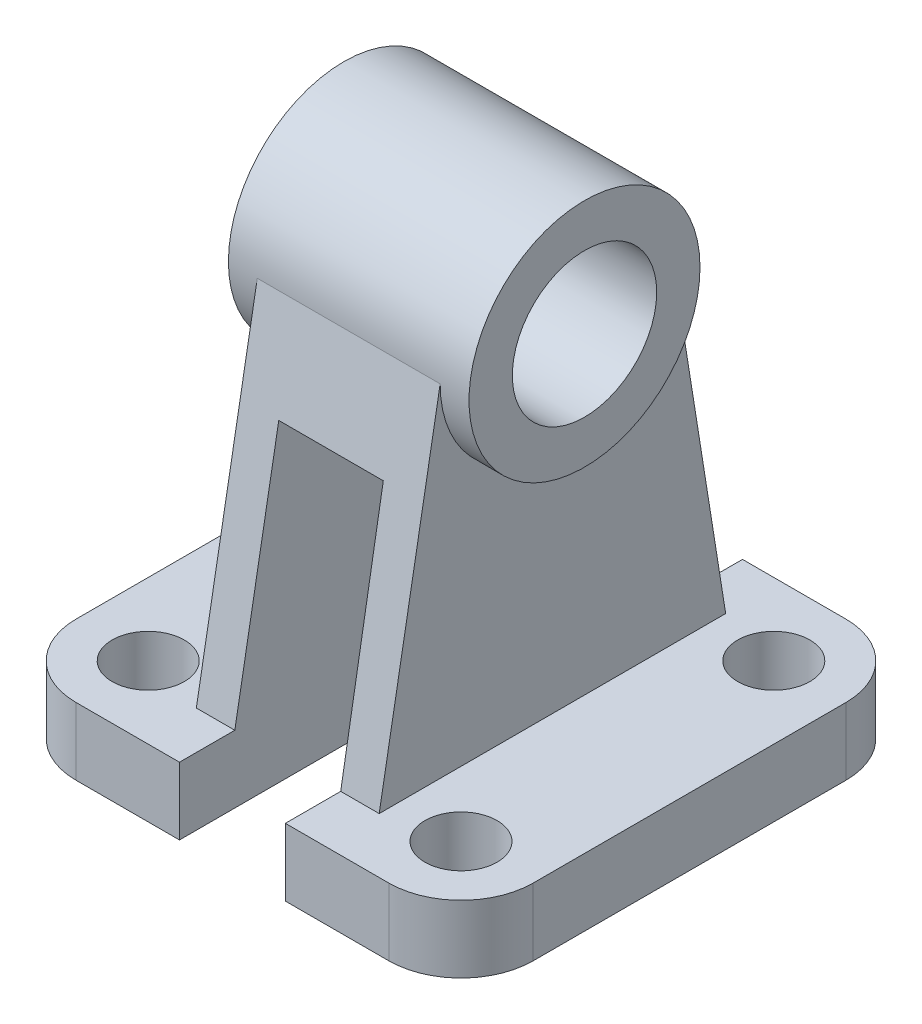
ISO-10303-21;
HEADER;
FILE_DESCRIPTION(('STEP AP214'),'2;1');
FILE_NAME('part.step','',(''),(''),'','','');
FILE_SCHEMA(('AUTOMOTIVE_DESIGN { 1 0 10303 214 1 1 1 1 }'));
ENDSEC;
DATA;
#1=APPLICATION_CONTEXT('core data for automotive mechanical design processes');
#2=APPLICATION_PROTOCOL_DEFINITION('international standard','automotive_design',2000,#1);
#3=PRODUCT_CONTEXT('',#1,'mechanical');
#4=PRODUCT('Part','Part','',(#3));
#5=PRODUCT_RELATED_PRODUCT_CATEGORY('part','',(#4));
#6=PRODUCT_DEFINITION_FORMATION('','',#4);
#7=PRODUCT_DEFINITION_CONTEXT('part definition',#1,'design');
#8=PRODUCT_DEFINITION('design','',#6,#7);
#9=PRODUCT_DEFINITION_SHAPE('','',#8);
#10=(LENGTH_UNIT() NAMED_UNIT(*) SI_UNIT(.MILLI.,.METRE.));
#11=(NAMED_UNIT(*) PLANE_ANGLE_UNIT() SI_UNIT($,.RADIAN.));
#12=(NAMED_UNIT(*) SI_UNIT($,.STERADIAN.) SOLID_ANGLE_UNIT());
#13=UNCERTAINTY_MEASURE_WITH_UNIT(LENGTH_MEASURE(1.E-05),#10,'distance_accuracy_value','');
#14=(GEOMETRIC_REPRESENTATION_CONTEXT(3) GLOBAL_UNCERTAINTY_ASSIGNED_CONTEXT((#13)) GLOBAL_UNIT_ASSIGNED_CONTEXT((#10,
#11,#12)) REPRESENTATION_CONTEXT('',''));
#15=CARTESIAN_POINT('',(0.,0.,0.));
#16=DIRECTION('',(0.,0.,1.));
#17=DIRECTION('',(1.,0.,0.));
#18=AXIS2_PLACEMENT_3D('',#15,#16,#17);
#19=CARTESIAN_POINT('',(-9.63203457629437,0.,-80.));
#20=DIRECTION('',(0.,-1.,0.));
#21=DIRECTION('',(0.,0.,-1.));
#22=AXIS2_PLACEMENT_3D('',#19,#20,#21);
#23=PLANE('',#22);
#24=CARTESIAN_POINT('',(-9.63203457629448,0.,-15.));
#25=DIRECTION('',(0.,1.,0.));
#26=DIRECTION('',(0.,0.,1.));
#27=AXIS2_PLACEMENT_3D('',#24,#25,#26);
#28=CIRCLE('',#27,7.5);
#29=CARTESIAN_POINT('',(-9.63203457629448,0.,-7.5));
#30=VERTEX_POINT('',#29);
#31=EDGE_CURVE('E497',#30,#30,#28,.T.);
#32=ORIENTED_EDGE('',*,*,#31,.F.);
#33=EDGE_LOOP('',(#32));
#34=FACE_BOUND('',#33,.T.);
#35=CARTESIAN_POINT('',(-9.63203457629437,0.,-80.));
#36=DIRECTION('',(0.,1.,0.));
#37=DIRECTION('',(0.,0.,1.));
#38=AXIS2_PLACEMENT_3D('',#35,#36,#37);
#39=CIRCLE('',#38,7.5);
#40=CARTESIAN_POINT('',(-9.63203457629437,0.,-72.5));
#41=VERTEX_POINT('',#40);
#42=EDGE_CURVE('E493',#41,#41,#39,.T.);
#43=ORIENTED_EDGE('',*,*,#42,.F.);
#44=EDGE_LOOP('',(#43));
#45=FACE_BOUND('',#44,.T.);
#46=DIRECTION('',(1.,0.,0.));
#47=VECTOR('',#46,1.);
#48=CARTESIAN_POINT('',(3.86796542370552,0.,-11.5));
#49=LINE('',#48,#47);
#50=CARTESIAN_POINT('',(3.86796542370552,0.,-11.5));
#51=VERTEX_POINT('',#50);
#52=CARTESIAN_POINT('',(11.8679654237055,0.,-11.5));
#53=VERTEX_POINT('',#52);
#54=EDGE_CURVE('E269',#51,#53,#49,.T.);
#55=ORIENTED_EDGE('',*,*,#54,.F.);
#56=DIRECTION('',(0.,0.,1.));
#57=VECTOR('',#56,1.);
#58=CARTESIAN_POINT('',(3.86796542370552,0.,0.));
#59=LINE('',#58,#57);
#60=CARTESIAN_POINT('',(3.86796542370552,0.,-83.5));
#61=VERTEX_POINT('',#60);
#62=EDGE_CURVE('E274',#61,#51,#59,.T.);
#63=ORIENTED_EDGE('',*,*,#62,.F.);
#64=DIRECTION('',(1.,0.,0.));
#65=VECTOR('',#64,1.);
#66=CARTESIAN_POINT('',(3.86796542370552,0.,-83.5));
#67=LINE('',#66,#65);
#68=CARTESIAN_POINT('',(11.8679654237055,0.,-83.5));
#69=VERTEX_POINT('',#68);
#70=EDGE_CURVE('E488',#61,#69,#67,.T.);
#71=ORIENTED_EDGE('',*,*,#70,.T.);
#72=DIRECTION('',(0.,0.,-1.));
#73=VECTOR('',#72,1.);
#74=CARTESIAN_POINT('',(11.8679654237055,0.,0.));
#75=LINE('',#74,#73);
#76=CARTESIAN_POINT('',(11.8679654237055,0.,-95.));
#77=VERTEX_POINT('',#76);
#78=EDGE_CURVE('E144',#69,#77,#75,.T.);
#79=ORIENTED_EDGE('',*,*,#78,.T.);
#80=DIRECTION('',(-1.,0.,0.));
#81=VECTOR('',#80,1.);
#82=CARTESIAN_POINT('',(-9.63203457629437,0.,-95.));
#83=LINE('',#82,#81);
#84=CARTESIAN_POINT('',(-9.63203457629437,0.,-95.));
#85=VERTEX_POINT('',#84);
#86=EDGE_CURVE('E143',#77,#85,#83,.T.);
#87=ORIENTED_EDGE('',*,*,#86,.T.);
#88=CARTESIAN_POINT('',(-9.63203457629437,0.,-80.));
#89=DIRECTION('',(0.,1.,0.));
#90=DIRECTION('',(0.,0.,-1.));
#91=AXIS2_PLACEMENT_3D('',#88,#89,#90);
#92=CIRCLE('',#91,15.);
#93=CARTESIAN_POINT('',(-24.6320345762944,0.,-80.));
#94=VERTEX_POINT('',#93);
#95=EDGE_CURVE('E147',#85,#94,#92,.T.);
#96=ORIENTED_EDGE('',*,*,#95,.T.);
#97=DIRECTION('',(0.,0.,1.));
#98=VECTOR('',#97,1.);
#99=CARTESIAN_POINT('',(-24.6320345762945,0.,-15.0000000000001));
#100=LINE('',#99,#98);
#101=CARTESIAN_POINT('',(-24.6320345762945,0.,-15.0000000000001));
#102=VERTEX_POINT('',#101);
#103=EDGE_CURVE('E150',#94,#102,#100,.T.);
#104=ORIENTED_EDGE('',*,*,#103,.T.);
#105=CARTESIAN_POINT('',(-9.63203457629448,0.,-15.));
#106=DIRECTION('',(0.,1.,0.));
#107=DIRECTION('',(0.,0.,-1.));
#108=AXIS2_PLACEMENT_3D('',#105,#106,#107);
#109=CIRCLE('',#108,15.);
#110=CARTESIAN_POINT('',(-9.63203457629437,0.,0.));
#111=VERTEX_POINT('',#110);
#112=EDGE_CURVE('E116',#102,#111,#109,.T.);
#113=ORIENTED_EDGE('',*,*,#112,.T.);
#114=DIRECTION('',(1.,0.,0.));
#115=VECTOR('',#114,1.);
#116=CARTESIAN_POINT('',(-9.63203457629437,0.,0.));
#117=LINE('',#116,#115);
#118=CARTESIAN_POINT('',(11.8679654237055,0.,0.));
#119=VERTEX_POINT('',#118);
#120=EDGE_CURVE('E153',#111,#119,#117,.T.);
#121=ORIENTED_EDGE('',*,*,#120,.T.);
#122=EDGE_CURVE('E140',#119,#53,#75,.T.);
#123=ORIENTED_EDGE('',*,*,#122,.T.);
#124=EDGE_LOOP('',(#55,#63,#71,#79,#87,#96,#104,#113,#121,#123));
#125=FACE_BOUND('',#124,.T.);
#126=ADVANCED_FACE('F39',(#34,#45,#125),#23,.F.);
#127=CARTESIAN_POINT('',(11.8679654237055,-14.,0.));
#128=DIRECTION('',(1.,0.,0.));
#129=DIRECTION('',(0.,0.,-1.));
#130=AXIS2_PLACEMENT_3D('',#127,#128,#129);
#131=PLANE('',#130);
#132=ORIENTED_EDGE('',*,*,#122,.F.);
#133=DIRECTION('',(0.,1.,0.));
#134=VECTOR('',#133,1.);
#135=CARTESIAN_POINT('',(11.8679654237055,-14.,0.));
#136=LINE('',#135,#134);
#137=CARTESIAN_POINT('',(11.8679654237055,-14.,0.));
#138=VERTEX_POINT('',#137);
#139=EDGE_CURVE('E63',#138,#119,#136,.T.);
#140=ORIENTED_EDGE('',*,*,#139,.F.);
#141=DIRECTION('',(0.,0.,-1.));
#142=VECTOR('',#141,1.);
#143=CARTESIAN_POINT('',(11.8679654237055,-14.,0.));
#144=LINE('',#143,#142);
#145=CARTESIAN_POINT('',(11.8679654237055,-14.,-95.));
#146=VERTEX_POINT('',#145);
#147=EDGE_CURVE('E156',#138,#146,#144,.T.);
#148=ORIENTED_EDGE('',*,*,#147,.T.);
#149=DIRECTION('',(0.,1.,0.));
#150=VECTOR('',#149,1.);
#151=CARTESIAN_POINT('',(11.8679654237055,-14.,-95.));
#152=LINE('',#151,#150);
#153=EDGE_CURVE('E97',#146,#77,#152,.T.);
#154=ORIENTED_EDGE('',*,*,#153,.T.);
#155=ORIENTED_EDGE('',*,*,#78,.F.);
#156=DIRECTION('',(0.,0.987498818473332,0.157626404874858));
#157=VECTOR('',#156,1.);
#158=CARTESIAN_POINT('',(11.8679654237055,-16.26609578385,-86.0964245746868));
#159=LINE('',#158,#157);
#160=CARTESIAN_POINT('',(11.8679654237055,41.1475956372231,-76.9319439697487));
#161=VERTEX_POINT('',#160);
#162=EDGE_CURVE('E385',#69,#161,#159,.T.);
#163=ORIENTED_EDGE('',*,*,#162,.T.);
#164=DIRECTION('',(0.,0.175633100115761,0.984455694352837));
#165=VECTOR('',#164,1.);
#166=CARTESIAN_POINT('',(11.8679654237055,36.3222335929638,-103.978982020402));
#167=LINE('',#166,#165);
#168=CARTESIAN_POINT('',(11.8679654237055,51.1916961063475,-20.6329212060196));
#169=VERTEX_POINT('',#168);
#170=EDGE_CURVE('E262',#161,#169,#167,.T.);
#171=ORIENTED_EDGE('',*,*,#170,.T.);
#172=DIRECTION('',(0.,-0.984455694352837,0.175633100115761));
#173=VECTOR('',#172,1.);
#174=CARTESIAN_POINT('',(11.8679654237055,0.,-11.5));
#175=LINE('',#174,#173);
#176=EDGE_CURVE('E259',#169,#53,#175,.T.);
#177=ORIENTED_EDGE('',*,*,#176,.T.);
#178=EDGE_LOOP('',(#132,#140,#148,#154,#155,#163,#171,#177));
#179=FACE_BOUND('',#178,.T.);
#180=ADVANCED_FACE('F41',(#179),#131,.T.);
#181=CARTESIAN_POINT('',(-9.63203457629437,-14.,0.));
#182=DIRECTION('',(0.,0.,1.));
#183=DIRECTION('',(1.,0.,0.));
#184=AXIS2_PLACEMENT_3D('',#181,#182,#183);
#185=PLANE('',#184);
#186=ORIENTED_EDGE('',*,*,#120,.F.);
#187=DIRECTION('',(0.,1.,0.));
#188=VECTOR('',#187,1.);
#189=CARTESIAN_POINT('',(-9.63203457629437,-14.,0.));
#190=LINE('',#189,#188);
#191=CARTESIAN_POINT('',(-9.63203457629437,-14.,0.));
#192=VERTEX_POINT('',#191);
#193=EDGE_CURVE('E121',#192,#111,#190,.T.);
#194=ORIENTED_EDGE('',*,*,#193,.F.);
#195=DIRECTION('',(1.,0.,0.));
#196=VECTOR('',#195,1.);
#197=CARTESIAN_POINT('',(-9.63203457629437,-14.,0.));
#198=LINE('',#197,#196);
#199=EDGE_CURVE('E130',#192,#138,#198,.T.);
#200=ORIENTED_EDGE('',*,*,#199,.T.);
#201=ORIENTED_EDGE('',*,*,#139,.T.);
#202=EDGE_LOOP('',(#186,#194,#200,#201));
#203=FACE_BOUND('',#202,.T.);
#204=ADVANCED_FACE('F276',(#203),#185,.T.);
#205=CARTESIAN_POINT('',(-9.63203457629448,-14.,-15.));
#206=DIRECTION('',(0.,1.,0.));
#207=DIRECTION('',(0.,0.,1.));
#208=AXIS2_PLACEMENT_3D('',#205,#206,#207);
#209=CYLINDRICAL_SURFACE('',#208,15.);
#210=ORIENTED_EDGE('',*,*,#112,.F.);
#211=DIRECTION('',(0.,1.,0.));
#212=VECTOR('',#211,1.);
#213=CARTESIAN_POINT('',(-24.6320345762945,-14.,-15.0000000000001));
#214=LINE('',#213,#212);
#215=CARTESIAN_POINT('',(-24.6320345762945,-14.,-15.0000000000001));
#216=VERTEX_POINT('',#215);
#217=EDGE_CURVE('E110',#216,#102,#214,.T.);
#218=ORIENTED_EDGE('',*,*,#217,.F.);
#219=CARTESIAN_POINT('',(-9.63203457629448,-14.,-15.));
#220=DIRECTION('',(0.,1.,0.));
#221=DIRECTION('',(0.,0.,-1.));
#222=AXIS2_PLACEMENT_3D('',#219,#220,#221);
#223=CIRCLE('',#222,15.);
#224=EDGE_CURVE('E113',#216,#192,#223,.T.);
#225=ORIENTED_EDGE('',*,*,#224,.T.);
#226=ORIENTED_EDGE('',*,*,#193,.T.);
#227=EDGE_LOOP('',(#210,#218,#225,#226));
#228=FACE_BOUND('',#227,.T.);
#229=ADVANCED_FACE('F112',(#228),#209,.T.);
#230=CARTESIAN_POINT('',(-24.6320345762945,-14.,-15.0000000000001));
#231=DIRECTION('',(-1.,0.,0.));
#232=DIRECTION('',(0.,0.,1.));
#233=AXIS2_PLACEMENT_3D('',#230,#231,#232);
#234=PLANE('',#233);
#235=ORIENTED_EDGE('',*,*,#103,.F.);
#236=DIRECTION('',(0.,1.,0.));
#237=VECTOR('',#236,1.);
#238=CARTESIAN_POINT('',(-24.6320345762944,-14.,-80.));
#239=LINE('',#238,#237);
#240=CARTESIAN_POINT('',(-24.6320345762944,-14.,-80.));
#241=VERTEX_POINT('',#240);
#242=EDGE_CURVE('E122',#241,#94,#239,.T.);
#243=ORIENTED_EDGE('',*,*,#242,.F.);
#244=DIRECTION('',(0.,0.,1.));
#245=VECTOR('',#244,1.);
#246=CARTESIAN_POINT('',(-24.6320345762945,-14.,-15.0000000000001));
#247=LINE('',#246,#245);
#248=EDGE_CURVE('E128',#241,#216,#247,.T.);
#249=ORIENTED_EDGE('',*,*,#248,.T.);
#250=ORIENTED_EDGE('',*,*,#217,.T.);
#251=EDGE_LOOP('',(#235,#243,#249,#250));
#252=FACE_BOUND('',#251,.T.);
#253=ADVANCED_FACE('F132',(#252),#234,.T.);
#254=CARTESIAN_POINT('',(-9.63203457629437,-14.,-80.));
#255=DIRECTION('',(0.,1.,0.));
#256=DIRECTION('',(0.,0.,1.));
#257=AXIS2_PLACEMENT_3D('',#254,#255,#256);
#258=CYLINDRICAL_SURFACE('',#257,15.);
#259=ORIENTED_EDGE('',*,*,#95,.F.);
#260=DIRECTION('',(0.,1.,0.));
#261=VECTOR('',#260,1.);
#262=CARTESIAN_POINT('',(-9.63203457629437,-14.,-95.));
#263=LINE('',#262,#261);
#264=CARTESIAN_POINT('',(-9.63203457629437,-14.,-95.));
#265=VERTEX_POINT('',#264);
#266=EDGE_CURVE('E160',#265,#85,#263,.T.);
#267=ORIENTED_EDGE('',*,*,#266,.F.);
#268=CARTESIAN_POINT('',(-9.63203457629437,-14.,-80.));
#269=DIRECTION('',(0.,1.,0.));
#270=DIRECTION('',(0.,0.,-1.));
#271=AXIS2_PLACEMENT_3D('',#268,#269,#270);
#272=CIRCLE('',#271,15.);
#273=EDGE_CURVE('E133',#265,#241,#272,.T.);
#274=ORIENTED_EDGE('',*,*,#273,.T.);
#275=ORIENTED_EDGE('',*,*,#242,.T.);
#276=EDGE_LOOP('',(#259,#267,#274,#275));
#277=FACE_BOUND('',#276,.T.);
#278=ADVANCED_FACE('F534',(#277),#258,.T.);
#279=CARTESIAN_POINT('',(-9.63203457629437,-14.,-95.));
#280=DIRECTION('',(0.,0.,-1.));
#281=DIRECTION('',(-1.,0.,0.));
#282=AXIS2_PLACEMENT_3D('',#279,#280,#281);
#283=PLANE('',#282);
#284=ORIENTED_EDGE('',*,*,#86,.F.);
#285=ORIENTED_EDGE('',*,*,#153,.F.);
#286=DIRECTION('',(-1.,0.,0.));
#287=VECTOR('',#286,1.);
#288=CARTESIAN_POINT('',(-9.63203457629437,-14.,-95.));
#289=LINE('',#288,#287);
#290=EDGE_CURVE('E135',#146,#265,#289,.T.);
#291=ORIENTED_EDGE('',*,*,#290,.T.);
#292=ORIENTED_EDGE('',*,*,#266,.T.);
#293=EDGE_LOOP('',(#284,#285,#291,#292));
#294=FACE_BOUND('',#293,.T.);
#295=ADVANCED_FACE('F295',(#294),#283,.T.);
#296=CARTESIAN_POINT('',(-9.63203457629437,-14.,-80.));
#297=DIRECTION('',(0.,-1.,0.));
#298=DIRECTION('',(0.,0.,-1.));
#299=AXIS2_PLACEMENT_3D('',#296,#297,#298);
#300=PLANE('',#299);
#301=CARTESIAN_POINT('',(-9.63203457629437,-14.,-80.));
#302=DIRECTION('',(0.,1.,0.));
#303=DIRECTION('',(0.,0.,1.));
#304=AXIS2_PLACEMENT_3D('',#301,#302,#303);
#305=CIRCLE('',#304,7.5);
#306=CARTESIAN_POINT('',(-9.63203457629437,-14.,-72.5));
#307=VERTEX_POINT('',#306);
#308=EDGE_CURVE('E494',#307,#307,#305,.T.);
#309=ORIENTED_EDGE('',*,*,#308,.T.);
#310=EDGE_LOOP('',(#309));
#311=FACE_BOUND('',#310,.T.);
#312=CARTESIAN_POINT('',(-9.63203457629448,-14.,-15.));
#313=DIRECTION('',(0.,1.,0.));
#314=DIRECTION('',(0.,0.,1.));
#315=AXIS2_PLACEMENT_3D('',#312,#313,#314);
#316=CIRCLE('',#315,7.5);
#317=CARTESIAN_POINT('',(-9.63203457629448,-14.,-7.5));
#318=VERTEX_POINT('',#317);
#319=EDGE_CURVE('E500',#318,#318,#316,.T.);
#320=ORIENTED_EDGE('',*,*,#319,.T.);
#321=EDGE_LOOP('',(#320));
#322=FACE_BOUND('',#321,.T.);
#323=ORIENTED_EDGE('',*,*,#147,.F.);
#324=ORIENTED_EDGE('',*,*,#199,.F.);
#325=ORIENTED_EDGE('',*,*,#224,.F.);
#326=ORIENTED_EDGE('',*,*,#248,.F.);
#327=ORIENTED_EDGE('',*,*,#273,.F.);
#328=ORIENTED_EDGE('',*,*,#290,.F.);
#329=EDGE_LOOP('',(#323,#324,#325,#326,#327,#328));
#330=FACE_BOUND('',#329,.T.);
#331=ADVANCED_FACE('F126',(#311,#322,#330),#300,.T.);
#332=CARTESIAN_POINT('',(-9.63203457629448,-14.,-15.));
#333=DIRECTION('',(0.,1.,0.));
#334=DIRECTION('',(0.,0.,1.));
#335=AXIS2_PLACEMENT_3D('',#332,#333,#334);
#336=CYLINDRICAL_SURFACE('',#335,7.5);
#337=ORIENTED_EDGE('',*,*,#319,.F.);
#338=EDGE_LOOP('',(#337));
#339=FACE_BOUND('',#338,.T.);
#340=ORIENTED_EDGE('',*,*,#31,.T.);
#341=EDGE_LOOP('',(#340));
#342=FACE_BOUND('',#341,.T.);
#343=ADVANCED_FACE('F294',(#339,#342),#336,.F.);
#344=CARTESIAN_POINT('',(-9.63203457629437,-14.,-80.));
#345=DIRECTION('',(0.,1.,0.));
#346=DIRECTION('',(0.,0.,1.));
#347=AXIS2_PLACEMENT_3D('',#344,#345,#346);
#348=CYLINDRICAL_SURFACE('',#347,7.5);
#349=ORIENTED_EDGE('',*,*,#308,.F.);
#350=EDGE_LOOP('',(#349));
#351=FACE_BOUND('',#350,.T.);
#352=ORIENTED_EDGE('',*,*,#42,.T.);
#353=EDGE_LOOP('',(#352));
#354=FACE_BOUND('',#353,.T.);
#355=ADVANCED_FACE('F299',(#351,#354),#348,.F.);
#356=CARTESIAN_POINT('',(3.86796542370552,0.,0.));
#357=DIRECTION('',(0.,1.,0.));
#358=DIRECTION('',(0.,0.,1.));
#359=AXIS2_PLACEMENT_3D('',#356,#357,#358);
#360=PLANE('',#359);
#361=DIRECTION('',(0.,0.,1.));
#362=VECTOR('',#361,1.);
#363=CARTESIAN_POINT('',(33.8679654237055,0.,0.));
#364=LINE('',#363,#362);
#365=CARTESIAN_POINT('',(33.8679654237055,0.,-83.5));
#366=VERTEX_POINT('',#365);
#367=CARTESIAN_POINT('',(33.8679654237055,0.,-11.5));
#368=VERTEX_POINT('',#367);
#369=EDGE_CURVE('E480',#366,#368,#364,.T.);
#370=ORIENTED_EDGE('',*,*,#369,.T.);
#371=DIRECTION('',(0.000943540534123292,0.,0.999999554865531));
#372=VECTOR('',#371,1.);
#373=CARTESIAN_POINT('',(33.7807075457544,0.,-103.979163272682));
#374=LINE('',#373,#372);
#375=CARTESIAN_POINT('',(33.8000304750085,0.,-83.5));
#376=VERTEX_POINT('',#375);
#377=EDGE_CURVE('E386',#376,#368,#374,.T.);
#378=ORIENTED_EDGE('',*,*,#377,.F.);
#379=EDGE_CURVE('E273',#376,#366,#67,.T.);
#380=ORIENTED_EDGE('',*,*,#379,.T.);
#381=EDGE_LOOP('',(#370,#378,#380));
#382=FACE_BOUND('',#381,.T.);
#383=ADVANCED_FACE('F303',(#382),#360,.F.);
#384=CARTESIAN_POINT('',(3.86796542370552,-1.98838456354674,-11.1452596626529));
#385=DIRECTION('',(0.,-0.175633100115761,-0.984455694352837));
#386=DIRECTION('',(0.,0.984455694352837,-0.175633100115761));
#387=AXIS2_PLACEMENT_3D('',#384,#385,#386);
#388=PLANE('',#387);
#389=ORIENTED_EDGE('',*,*,#54,.T.);
#390=ORIENTED_EDGE('',*,*,#176,.F.);
#391=DIRECTION('',(-1.,0.,0.));
#392=VECTOR('',#391,1.);
#393=CARTESIAN_POINT('',(11.8679654237055,51.1916961063475,-20.6329212060196));
#394=LINE('',#393,#392);
#395=CARTESIAN_POINT('',(33.5886095985096,51.1916961063475,-20.6329212060196));
#396=VERTEX_POINT('',#395);
#397=EDGE_CURVE('E266',#396,#169,#394,.T.);
#398=ORIENTED_EDGE('',*,*,#397,.F.);
#399=DIRECTION('',(-0.00537214988582703,0.984441488557431,-0.175630565712333));
#400=VECTOR('',#399,1.);
#401=CARTESIAN_POINT('',(33.5886095985096,51.1916961063475,-20.6329212060196));
#402=LINE('',#401,#400);
#403=EDGE_CURVE('E507',#368,#396,#402,.T.);
#404=ORIENTED_EDGE('',*,*,#403,.F.);
#405=DIRECTION('',(-1.,0.,0.));
#406=VECTOR('',#405,1.);
#407=CARTESIAN_POINT('',(41.8679654237055,0.,-11.5));
#408=LINE('',#407,#406);
#409=CARTESIAN_POINT('',(41.8679654237055,0.,-11.5));
#410=VERTEX_POINT('',#409);
#411=EDGE_CURVE('E416',#410,#368,#408,.T.);
#412=ORIENTED_EDGE('',*,*,#411,.F.);
#413=DIRECTION('',(0.,0.984455694352837,-0.175633100115761));
#414=VECTOR('',#413,1.);
#415=CARTESIAN_POINT('',(41.8679654237055,-1.98838456354674,-11.1452596626529));
#416=LINE('',#415,#414);
#417=CARTESIAN_POINT('',(41.8679654237055,71.,-24.1668474566715));
#418=VERTEX_POINT('',#417);
#419=EDGE_CURVE('E408',#410,#418,#416,.T.);
#420=ORIENTED_EDGE('',*,*,#419,.T.);
#421=DIRECTION('',(1.,0.,0.));
#422=VECTOR('',#421,1.);
#423=CARTESIAN_POINT('',(3.86796542370552,71.,-24.1668474566715));
#424=LINE('',#423,#422);
#425=CARTESIAN_POINT('',(3.86796542370552,71.,-24.1668474566715));
#426=VERTEX_POINT('',#425);
#427=EDGE_CURVE('E186',#426,#418,#424,.T.);
#428=ORIENTED_EDGE('',*,*,#427,.F.);
#429=DIRECTION('',(0.,0.984455694352837,-0.175633100115761));
#430=VECTOR('',#429,1.);
#431=CARTESIAN_POINT('',(3.86796542370552,-1.98838456354674,-11.1452596626529));
#432=LINE('',#431,#430);
#433=EDGE_CURVE('E176',#51,#426,#432,.T.);
#434=ORIENTED_EDGE('',*,*,#433,.F.);
#435=EDGE_LOOP('',(#389,#390,#398,#404,#412,#420,#428,#434));
#436=FACE_BOUND('',#435,.T.);
#437=ADVANCED_FACE('F270',(#436),#388,.F.);
#438=CARTESIAN_POINT('',(3.86796542370552,71.,-48.1668474566715));
#439=DIRECTION('',(1.,0.,0.));
#440=DIRECTION('',(0.,0.,-1.));
#441=AXIS2_PLACEMENT_3D('',#438,#439,#440);
#442=CYLINDRICAL_SURFACE('',#441,24.);
#443=ORIENTED_EDGE('',*,*,#427,.T.);
#444=CARTESIAN_POINT('',(41.8679654237055,71.,-48.1668474566715));
#445=DIRECTION('',(-1.,0.,0.));
#446=DIRECTION('',(0.,0.,1.));
#447=AXIS2_PLACEMENT_3D('',#444,#445,#446);
#448=CIRCLE('',#447,24.);
#449=CARTESIAN_POINT('',(41.8679654237055,71.,-72.1668474566715));
#450=VERTEX_POINT('',#449);
#451=EDGE_CURVE('E11',#418,#450,#448,.F.);
#452=ORIENTED_EDGE('',*,*,#451,.T.);
#453=DIRECTION('',(1.,0.,0.));
#454=VECTOR('',#453,1.);
#455=CARTESIAN_POINT('',(3.86796542370552,71.,-72.1668474566715));
#456=LINE('',#455,#454);
#457=CARTESIAN_POINT('',(3.86796542370552,71.,-72.1668474566715));
#458=VERTEX_POINT('',#457);
#459=EDGE_CURVE('E189',#458,#450,#456,.T.);
#460=ORIENTED_EDGE('',*,*,#459,.F.);
#461=CARTESIAN_POINT('',(3.86796542370552,71.,-48.1668474566715));
#462=DIRECTION('',(-1.,0.,0.));
#463=DIRECTION('',(0.,0.,1.));
#464=AXIS2_PLACEMENT_3D('',#461,#462,#463);
#465=CIRCLE('',#464,24.);
#466=EDGE_CURVE('E47',#426,#458,#465,.F.);
#467=ORIENTED_EDGE('',*,*,#466,.F.);
#468=EDGE_LOOP('',(#443,#452,#460,#467));
#469=FACE_BOUND('',#468,.T.);
#470=CARTESIAN_POINT('',(-2.13203457629448,71.,-48.1668474566715));
#471=DIRECTION('',(-1.,0.,0.));
#472=DIRECTION('',(0.,0.,1.));
#473=AXIS2_PLACEMENT_3D('',#470,#471,#472);
#474=CIRCLE('',#473,24.);
#475=CARTESIAN_POINT('',(-2.13203457629448,71.,-24.1668474566715));
#476=VERTEX_POINT('',#475);
#477=EDGE_CURVE('E405',#476,#476,#474,.T.);
#478=ORIENTED_EDGE('',*,*,#477,.F.);
#479=EDGE_LOOP('',(#478));
#480=FACE_BOUND('',#479,.T.);
#481=CARTESIAN_POINT('',(47.8679654237055,71.,-48.1668474566715));
#482=DIRECTION('',(1.,0.,0.));
#483=DIRECTION('',(0.,0.,-1.));
#484=AXIS2_PLACEMENT_3D('',#481,#482,#483);
#485=CIRCLE('',#484,24.);
#486=CARTESIAN_POINT('',(47.8679654237055,71.,-72.1668474566715));
#487=VERTEX_POINT('',#486);
#488=EDGE_CURVE('E395',#487,#487,#485,.T.);
#489=ORIENTED_EDGE('',*,*,#488,.F.);
#490=EDGE_LOOP('',(#489));
#491=FACE_BOUND('',#490,.T.);
#492=ADVANCED_FACE('F184',(#469,#480,#491),#442,.T.);
#493=CARTESIAN_POINT('',(3.86796542370552,12.9972666959391,-81.4253520266));
#494=DIRECTION('',(0.,-0.157626404874858,0.987498818473332));
#495=DIRECTION('',(0.,-0.987498818473332,-0.157626404874858));
#496=AXIS2_PLACEMENT_3D('',#493,#494,#495);
#497=PLANE('',#496);
#498=DIRECTION('',(1.,0.,0.));
#499=VECTOR('',#498,1.);
#500=CARTESIAN_POINT('',(11.8679654237055,41.1475956372231,-76.9319439697487));
#501=LINE('',#500,#499);
#502=CARTESIAN_POINT('',(33.5886095985096,41.1475956372233,-76.9319439697486));
#503=VERTEX_POINT('',#502);
#504=EDGE_CURVE('E383',#161,#503,#501,.T.);
#505=ORIENTED_EDGE('',*,*,#504,.F.);
#506=ORIENTED_EDGE('',*,*,#162,.F.);
#507=ORIENTED_EDGE('',*,*,#70,.F.);
#508=DIRECTION('',(0.,-0.987498818473332,-0.157626404874858));
#509=VECTOR('',#508,1.);
#510=CARTESIAN_POINT('',(3.86796542370552,12.9972666959391,-81.4253520266));
#511=LINE('',#510,#509);
#512=EDGE_CURVE('E172',#458,#61,#511,.T.);
#513=ORIENTED_EDGE('',*,*,#512,.F.);
#514=ORIENTED_EDGE('',*,*,#459,.T.);
#515=DIRECTION('',(0.,0.987498818473332,0.157626404874858));
#516=VECTOR('',#515,1.);
#517=CARTESIAN_POINT('',(41.8679654237055,12.9972666959391,-81.4253520266));
#518=LINE('',#517,#516);
#519=CARTESIAN_POINT('',(41.8679654237055,0.,-83.5));
#520=VERTEX_POINT('',#519);
#521=EDGE_CURVE('E410',#520,#450,#518,.T.);
#522=ORIENTED_EDGE('',*,*,#521,.F.);
#523=DIRECTION('',(-1.,0.,0.));
#524=VECTOR('',#523,1.);
#525=CARTESIAN_POINT('',(41.8679654237055,0.,-83.5));
#526=LINE('',#525,#524);
#527=EDGE_CURVE('E415',#520,#366,#526,.T.);
#528=ORIENTED_EDGE('',*,*,#527,.T.);
#529=ORIENTED_EDGE('',*,*,#379,.F.);
#530=DIRECTION('',(0.00507381233699673,-0.987486107518241,-0.157624375928477));
#531=VECTOR('',#530,1.);
#532=CARTESIAN_POINT('',(33.6344172471558,32.232323717077,-78.3550163167384));
#533=LINE('',#532,#531);
#534=EDGE_CURVE('E389',#503,#376,#533,.T.);
#535=ORIENTED_EDGE('',*,*,#534,.F.);
#536=EDGE_LOOP('',(#505,#506,#507,#513,#514,#522,#528,#529,#535));
#537=FACE_BOUND('',#536,.T.);
#538=ADVANCED_FACE('F309',(#537),#497,.F.);
#539=CARTESIAN_POINT('',(3.86796542370552,0.,0.));
#540=DIRECTION('',(-1.,0.,0.));
#541=DIRECTION('',(0.,0.,1.));
#542=AXIS2_PLACEMENT_3D('',#539,#540,#541);
#543=PLANE('',#542);
#544=ORIENTED_EDGE('',*,*,#433,.T.);
#545=ORIENTED_EDGE('',*,*,#466,.T.);
#546=ORIENTED_EDGE('',*,*,#512,.T.);
#547=ORIENTED_EDGE('',*,*,#62,.T.);
#548=EDGE_LOOP('',(#544,#545,#546,#547));
#549=FACE_BOUND('',#548,.T.);
#550=ADVANCED_FACE('F168',(#549),#543,.T.);
#551=CARTESIAN_POINT('',(33.8679654237055,-14.,0.));
#552=DIRECTION('',(-1.,0.,0.));
#553=DIRECTION('',(0.,0.,1.));
#554=AXIS2_PLACEMENT_3D('',#551,#552,#553);
#555=PLANE('',#554);
#556=ORIENTED_EDGE('',*,*,#369,.F.);
#557=DIRECTION('',(0.,0.,1.));
#558=VECTOR('',#557,1.);
#559=CARTESIAN_POINT('',(33.8679654237055,0.,0.));
#560=LINE('',#559,#558);
#561=CARTESIAN_POINT('',(33.8679654237055,0.,-95.));
#562=VERTEX_POINT('',#561);
#563=EDGE_CURVE('E451',#562,#366,#560,.T.);
#564=ORIENTED_EDGE('',*,*,#563,.F.);
#565=DIRECTION('',(0.,1.,0.));
#566=VECTOR('',#565,1.);
#567=CARTESIAN_POINT('',(33.8679654237055,-14.,-95.));
#568=LINE('',#567,#566);
#569=CARTESIAN_POINT('',(33.8679654237055,-14.,-95.));
#570=VERTEX_POINT('',#569);
#571=EDGE_CURVE('E419',#570,#562,#568,.T.);
#572=ORIENTED_EDGE('',*,*,#571,.F.);
#573=DIRECTION('',(0.,0.,1.));
#574=VECTOR('',#573,1.);
#575=CARTESIAN_POINT('',(33.8679654237055,-14.,0.));
#576=LINE('',#575,#574);
#577=CARTESIAN_POINT('',(33.8679654237055,-14.,0.));
#578=VERTEX_POINT('',#577);
#579=EDGE_CURVE('E438',#570,#578,#576,.T.);
#580=ORIENTED_EDGE('',*,*,#579,.T.);
#581=DIRECTION('',(0.,1.,0.));
#582=VECTOR('',#581,1.);
#583=CARTESIAN_POINT('',(33.8679654237055,-14.,0.));
#584=LINE('',#583,#582);
#585=CARTESIAN_POINT('',(33.8679654237055,0.,0.));
#586=VERTEX_POINT('',#585);
#587=EDGE_CURVE('E421',#578,#586,#584,.T.);
#588=ORIENTED_EDGE('',*,*,#587,.T.);
#589=EDGE_CURVE('E450',#368,#586,#560,.T.);
#590=ORIENTED_EDGE('',*,*,#589,.F.);
#591=EDGE_LOOP('',(#556,#564,#572,#580,#588,#590));
#592=FACE_BOUND('',#591,.T.);
#593=ADVANCED_FACE('F318',(#592),#555,.T.);
#594=CARTESIAN_POINT('',(55.3679654237055,0.,-80.));
#595=DIRECTION('',(0.,-1.,0.));
#596=DIRECTION('',(0.,0.,-1.));
#597=AXIS2_PLACEMENT_3D('',#594,#595,#596);
#598=PLANE('',#597);
#599=CARTESIAN_POINT('',(55.3679654237055,0.,-15.));
#600=DIRECTION('',(0.,1.,0.));
#601=DIRECTION('',(0.,0.,1.));
#602=AXIS2_PLACEMENT_3D('',#599,#600,#601);
#603=CIRCLE('',#602,7.5);
#604=CARTESIAN_POINT('',(55.3679654237055,0.,-7.5));
#605=VERTEX_POINT('',#604);
#606=EDGE_CURVE('E471',#605,#605,#603,.T.);
#607=ORIENTED_EDGE('',*,*,#606,.F.);
#608=EDGE_LOOP('',(#607));
#609=FACE_BOUND('',#608,.T.);
#610=CARTESIAN_POINT('',(55.3679654237055,0.,-80.));
#611=DIRECTION('',(0.,1.,0.));
#612=DIRECTION('',(0.,0.,1.));
#613=AXIS2_PLACEMENT_3D('',#610,#611,#612);
#614=CIRCLE('',#613,7.5);
#615=CARTESIAN_POINT('',(55.3679654237055,0.,-72.5));
#616=VERTEX_POINT('',#615);
#617=EDGE_CURVE('E477',#616,#616,#614,.T.);
#618=ORIENTED_EDGE('',*,*,#617,.F.);
#619=EDGE_LOOP('',(#618));
#620=FACE_BOUND('',#619,.T.);
#621=ORIENTED_EDGE('',*,*,#527,.F.);
#622=DIRECTION('',(0.,0.,-1.));
#623=VECTOR('',#622,1.);
#624=CARTESIAN_POINT('',(41.8679654237055,0.,0.));
#625=LINE('',#624,#623);
#626=EDGE_CURVE('E413',#410,#520,#625,.T.);
#627=ORIENTED_EDGE('',*,*,#626,.F.);
#628=ORIENTED_EDGE('',*,*,#411,.T.);
#629=ORIENTED_EDGE('',*,*,#589,.T.);
#630=DIRECTION('',(1.,0.,0.));
#631=VECTOR('',#630,1.);
#632=CARTESIAN_POINT('',(33.8679654237055,0.,0.));
#633=LINE('',#632,#631);
#634=CARTESIAN_POINT('',(55.3679654237055,0.,0.));
#635=VERTEX_POINT('',#634);
#636=EDGE_CURVE('E447',#586,#635,#633,.T.);
#637=ORIENTED_EDGE('',*,*,#636,.T.);
#638=CARTESIAN_POINT('',(55.3679654237055,0.,-15.));
#639=DIRECTION('',(0.,1.,0.));
#640=DIRECTION('',(0.,0.,1.));
#641=AXIS2_PLACEMENT_3D('',#638,#639,#640);
#642=CIRCLE('',#641,15.);
#643=CARTESIAN_POINT('',(70.3679654237055,0.,-15.));
#644=VERTEX_POINT('',#643);
#645=EDGE_CURVE('E444',#635,#644,#642,.T.);
#646=ORIENTED_EDGE('',*,*,#645,.T.);
#647=DIRECTION('',(0.,0.,-1.));
#648=VECTOR('',#647,1.);
#649=CARTESIAN_POINT('',(70.3679654237055,0.,-15.));
#650=LINE('',#649,#648);
#651=CARTESIAN_POINT('',(70.3679654237055,0.,-80.));
#652=VERTEX_POINT('',#651);
#653=EDGE_CURVE('E441',#644,#652,#650,.T.);
#654=ORIENTED_EDGE('',*,*,#653,.T.);
#655=CARTESIAN_POINT('',(55.3679654237055,0.,-80.));
#656=DIRECTION('',(0.,1.,0.));
#657=DIRECTION('',(0.,0.,-1.));
#658=AXIS2_PLACEMENT_3D('',#655,#656,#657);
#659=CIRCLE('',#658,15.);
#660=CARTESIAN_POINT('',(55.3679654237055,0.,-95.));
#661=VERTEX_POINT('',#660);
#662=EDGE_CURVE('E437',#652,#661,#659,.T.);
#663=ORIENTED_EDGE('',*,*,#662,.T.);
#664=DIRECTION('',(-1.,0.,0.));
#665=VECTOR('',#664,1.);
#666=CARTESIAN_POINT('',(33.8679654237055,0.,-95.));
#667=LINE('',#666,#665);
#668=EDGE_CURVE('E434',#661,#562,#667,.T.);
#669=ORIENTED_EDGE('',*,*,#668,.T.);
#670=ORIENTED_EDGE('',*,*,#563,.T.);
#671=EDGE_LOOP('',(#621,#627,#628,#629,#637,#646,#654,#663,#669,#670));
#672=FACE_BOUND('',#671,.T.);
#673=ADVANCED_FACE('F333',(#609,#620,#672),#598,.F.);
#674=CARTESIAN_POINT('',(33.8679654237055,-14.,-95.));
#675=DIRECTION('',(0.,0.,-1.));
#676=DIRECTION('',(-1.,0.,0.));
#677=AXIS2_PLACEMENT_3D('',#674,#675,#676);
#678=PLANE('',#677);
#679=ORIENTED_EDGE('',*,*,#668,.F.);
#680=DIRECTION('',(0.,1.,0.));
#681=VECTOR('',#680,1.);
#682=CARTESIAN_POINT('',(55.3679654237055,-14.,-95.));
#683=LINE('',#682,#681);
#684=CARTESIAN_POINT('',(55.3679654237055,-14.,-95.));
#685=VERTEX_POINT('',#684);
#686=EDGE_CURVE('E431',#685,#661,#683,.T.);
#687=ORIENTED_EDGE('',*,*,#686,.F.);
#688=DIRECTION('',(-1.,0.,0.));
#689=VECTOR('',#688,1.);
#690=CARTESIAN_POINT('',(33.8679654237055,-14.,-95.));
#691=LINE('',#690,#689);
#692=EDGE_CURVE('E424',#685,#570,#691,.T.);
#693=ORIENTED_EDGE('',*,*,#692,.T.);
#694=ORIENTED_EDGE('',*,*,#571,.T.);
#695=EDGE_LOOP('',(#679,#687,#693,#694));
#696=FACE_BOUND('',#695,.T.);
#697=ADVANCED_FACE('F336',(#696),#678,.T.);
#698=CARTESIAN_POINT('',(55.3679654237055,-14.,-80.));
#699=DIRECTION('',(0.,1.,0.));
#700=DIRECTION('',(0.,0.,1.));
#701=AXIS2_PLACEMENT_3D('',#698,#699,#700);
#702=CYLINDRICAL_SURFACE('',#701,15.);
#703=ORIENTED_EDGE('',*,*,#662,.F.);
#704=DIRECTION('',(0.,1.,0.));
#705=VECTOR('',#704,1.);
#706=CARTESIAN_POINT('',(70.3679654237055,-14.,-80.));
#707=LINE('',#706,#705);
#708=CARTESIAN_POINT('',(70.3679654237055,-14.,-80.));
#709=VERTEX_POINT('',#708);
#710=EDGE_CURVE('E429',#709,#652,#707,.T.);
#711=ORIENTED_EDGE('',*,*,#710,.F.);
#712=CARTESIAN_POINT('',(55.3679654237055,-14.,-80.));
#713=DIRECTION('',(0.,1.,0.));
#714=DIRECTION('',(0.,0.,-1.));
#715=AXIS2_PLACEMENT_3D('',#712,#713,#714);
#716=CIRCLE('',#715,15.);
#717=EDGE_CURVE('E457',#709,#685,#716,.T.);
#718=ORIENTED_EDGE('',*,*,#717,.T.);
#719=ORIENTED_EDGE('',*,*,#686,.T.);
#720=EDGE_LOOP('',(#703,#711,#718,#719));
#721=FACE_BOUND('',#720,.T.);
#722=ADVANCED_FACE('F340',(#721),#702,.T.);
#723=CARTESIAN_POINT('',(70.3679654237055,-14.,-15.));
#724=DIRECTION('',(1.,0.,0.));
#725=DIRECTION('',(0.,0.,-1.));
#726=AXIS2_PLACEMENT_3D('',#723,#724,#725);
#727=PLANE('',#726);
#728=ORIENTED_EDGE('',*,*,#653,.F.);
#729=DIRECTION('',(0.,1.,0.));
#730=VECTOR('',#729,1.);
#731=CARTESIAN_POINT('',(70.3679654237055,-14.,-15.));
#732=LINE('',#731,#730);
#733=CARTESIAN_POINT('',(70.3679654237055,-14.,-15.));
#734=VERTEX_POINT('',#733);
#735=EDGE_CURVE('E427',#734,#644,#732,.T.);
#736=ORIENTED_EDGE('',*,*,#735,.F.);
#737=DIRECTION('',(0.,0.,-1.));
#738=VECTOR('',#737,1.);
#739=CARTESIAN_POINT('',(70.3679654237055,-14.,-15.));
#740=LINE('',#739,#738);
#741=EDGE_CURVE('E460',#734,#709,#740,.T.);
#742=ORIENTED_EDGE('',*,*,#741,.T.);
#743=ORIENTED_EDGE('',*,*,#710,.T.);
#744=EDGE_LOOP('',(#728,#736,#742,#743));
#745=FACE_BOUND('',#744,.T.);
#746=ADVANCED_FACE('F344',(#745),#727,.T.);
#747=CARTESIAN_POINT('',(55.3679654237055,-14.,-15.));
#748=DIRECTION('',(0.,1.,0.));
#749=DIRECTION('',(0.,0.,1.));
#750=AXIS2_PLACEMENT_3D('',#747,#748,#749);
#751=CYLINDRICAL_SURFACE('',#750,15.);
#752=ORIENTED_EDGE('',*,*,#645,.F.);
#753=DIRECTION('',(0.,1.,0.));
#754=VECTOR('',#753,1.);
#755=CARTESIAN_POINT('',(55.3679654237055,-14.,0.));
#756=LINE('',#755,#754);
#757=CARTESIAN_POINT('',(55.3679654237055,-14.,0.));
#758=VERTEX_POINT('',#757);
#759=EDGE_CURVE('E425',#758,#635,#756,.T.);
#760=ORIENTED_EDGE('',*,*,#759,.F.);
#761=CARTESIAN_POINT('',(55.3679654237055,-14.,-15.));
#762=DIRECTION('',(0.,1.,0.));
#763=DIRECTION('',(0.,0.,1.));
#764=AXIS2_PLACEMENT_3D('',#761,#762,#763);
#765=CIRCLE('',#764,15.);
#766=EDGE_CURVE('E463',#758,#734,#765,.T.);
#767=ORIENTED_EDGE('',*,*,#766,.T.);
#768=ORIENTED_EDGE('',*,*,#735,.T.);
#769=EDGE_LOOP('',(#752,#760,#767,#768));
#770=FACE_BOUND('',#769,.T.);
#771=ADVANCED_FACE('F348',(#770),#751,.T.);
#772=CARTESIAN_POINT('',(33.8679654237055,-14.,0.));
#773=DIRECTION('',(0.,0.,1.));
#774=DIRECTION('',(1.,0.,0.));
#775=AXIS2_PLACEMENT_3D('',#772,#773,#774);
#776=PLANE('',#775);
#777=ORIENTED_EDGE('',*,*,#636,.F.);
#778=ORIENTED_EDGE('',*,*,#587,.F.);
#779=DIRECTION('',(1.,0.,0.));
#780=VECTOR('',#779,1.);
#781=CARTESIAN_POINT('',(33.8679654237055,-14.,0.));
#782=LINE('',#781,#780);
#783=EDGE_CURVE('E466',#578,#758,#782,.T.);
#784=ORIENTED_EDGE('',*,*,#783,.T.);
#785=ORIENTED_EDGE('',*,*,#759,.T.);
#786=EDGE_LOOP('',(#777,#778,#784,#785));
#787=FACE_BOUND('',#786,.T.);
#788=ADVANCED_FACE('F331',(#787),#776,.T.);
#789=CARTESIAN_POINT('',(55.3679654237055,-14.,-80.));
#790=DIRECTION('',(0.,-1.,0.));
#791=DIRECTION('',(0.,0.,-1.));
#792=AXIS2_PLACEMENT_3D('',#789,#790,#791);
#793=PLANE('',#792);
#794=CARTESIAN_POINT('',(55.3679654237055,-14.,-80.));
#795=DIRECTION('',(0.,1.,0.));
#796=DIRECTION('',(0.,0.,1.));
#797=AXIS2_PLACEMENT_3D('',#794,#795,#796);
#798=CIRCLE('',#797,7.5);
#799=CARTESIAN_POINT('',(55.3679654237055,-14.,-72.5));
#800=VERTEX_POINT('',#799);
#801=EDGE_CURVE('E474',#800,#800,#798,.T.);
#802=ORIENTED_EDGE('',*,*,#801,.T.);
#803=EDGE_LOOP('',(#802));
#804=FACE_BOUND('',#803,.T.);
#805=CARTESIAN_POINT('',(55.3679654237055,-14.,-15.));
#806=DIRECTION('',(0.,1.,0.));
#807=DIRECTION('',(0.,0.,1.));
#808=AXIS2_PLACEMENT_3D('',#805,#806,#807);
#809=CIRCLE('',#808,7.5);
#810=CARTESIAN_POINT('',(55.3679654237055,-14.,-7.5));
#811=VERTEX_POINT('',#810);
#812=EDGE_CURVE('E454',#811,#811,#809,.T.);
#813=ORIENTED_EDGE('',*,*,#812,.T.);
#814=EDGE_LOOP('',(#813));
#815=FACE_BOUND('',#814,.T.);
#816=ORIENTED_EDGE('',*,*,#579,.F.);
#817=ORIENTED_EDGE('',*,*,#692,.F.);
#818=ORIENTED_EDGE('',*,*,#717,.F.);
#819=ORIENTED_EDGE('',*,*,#741,.F.);
#820=ORIENTED_EDGE('',*,*,#766,.F.);
#821=ORIENTED_EDGE('',*,*,#783,.F.);
#822=EDGE_LOOP('',(#816,#817,#818,#819,#820,#821));
#823=FACE_BOUND('',#822,.T.);
#824=ADVANCED_FACE('F327',(#804,#815,#823),#793,.T.);
#825=CARTESIAN_POINT('',(55.3679654237055,-14.,-15.));
#826=DIRECTION('',(0.,1.,0.));
#827=DIRECTION('',(0.,0.,1.));
#828=AXIS2_PLACEMENT_3D('',#825,#826,#827);
#829=CYLINDRICAL_SURFACE('',#828,7.5);
#830=ORIENTED_EDGE('',*,*,#812,.F.);
#831=EDGE_LOOP('',(#830));
#832=FACE_BOUND('',#831,.T.);
#833=ORIENTED_EDGE('',*,*,#606,.T.);
#834=EDGE_LOOP('',(#833));
#835=FACE_BOUND('',#834,.T.);
#836=ADVANCED_FACE('F323',(#832,#835),#829,.F.);
#837=CARTESIAN_POINT('',(55.3679654237055,-14.,-80.));
#838=DIRECTION('',(0.,1.,0.));
#839=DIRECTION('',(0.,0.,1.));
#840=AXIS2_PLACEMENT_3D('',#837,#838,#839);
#841=CYLINDRICAL_SURFACE('',#840,7.5);
#842=ORIENTED_EDGE('',*,*,#801,.F.);
#843=EDGE_LOOP('',(#842));
#844=FACE_BOUND('',#843,.T.);
#845=ORIENTED_EDGE('',*,*,#617,.T.);
#846=EDGE_LOOP('',(#845));
#847=FACE_BOUND('',#846,.T.);
#848=ADVANCED_FACE('F319',(#844,#847),#841,.F.);
#849=CARTESIAN_POINT('',(41.8679654237055,0.,0.));
#850=DIRECTION('',(-1.,0.,0.));
#851=DIRECTION('',(0.,0.,1.));
#852=AXIS2_PLACEMENT_3D('',#849,#850,#851);
#853=PLANE('',#852);
#854=ORIENTED_EDGE('',*,*,#451,.F.);
#855=ORIENTED_EDGE('',*,*,#419,.F.);
#856=ORIENTED_EDGE('',*,*,#626,.T.);
#857=ORIENTED_EDGE('',*,*,#521,.T.);
#858=EDGE_LOOP('',(#854,#855,#856,#857));
#859=FACE_BOUND('',#858,.T.);
#860=ADVANCED_FACE('F322',(#859),#853,.F.);
#861=CARTESIAN_POINT('',(-2.13203457629448,71.,-48.1668474566715));
#862=DIRECTION('',(-1.,0.,0.));
#863=DIRECTION('',(0.,0.,1.));
#864=AXIS2_PLACEMENT_3D('',#861,#862,#863);
#865=PLANE('',#864);
#866=ORIENTED_EDGE('',*,*,#477,.T.);
#867=EDGE_LOOP('',(#866));
#868=FACE_BOUND('',#867,.T.);
#869=CARTESIAN_POINT('',(-2.13203457629448,71.,-48.1668474566715));
#870=DIRECTION('',(-1.,0.,0.));
#871=DIRECTION('',(0.,0.,1.));
#872=AXIS2_PLACEMENT_3D('',#869,#870,#871);
#873=CIRCLE('',#872,15.);
#874=CARTESIAN_POINT('',(-2.13203457629448,71.,-33.1668474566715));
#875=VERTEX_POINT('',#874);
#876=EDGE_CURVE('E402',#875,#875,#873,.T.);
#877=ORIENTED_EDGE('',*,*,#876,.F.);
#878=EDGE_LOOP('',(#877));
#879=FACE_BOUND('',#878,.T.);
#880=ADVANCED_FACE('F361',(#868,#879),#865,.T.);
#881=CARTESIAN_POINT('',(-2.13203457629448,71.,-48.1668474566715));
#882=DIRECTION('',(1.,0.,0.));
#883=DIRECTION('',(0.,0.,-1.));
#884=AXIS2_PLACEMENT_3D('',#881,#882,#883);
#885=CYLINDRICAL_SURFACE('',#884,15.);
#886=ORIENTED_EDGE('',*,*,#876,.T.);
#887=EDGE_LOOP('',(#886));
#888=FACE_BOUND('',#887,.T.);
#889=CARTESIAN_POINT('',(47.8679654237055,71.,-48.1668474566715));
#890=DIRECTION('',(1.,0.,0.));
#891=DIRECTION('',(0.,0.,-1.));
#892=AXIS2_PLACEMENT_3D('',#889,#890,#891);
#893=CIRCLE('',#892,15.);
#894=CARTESIAN_POINT('',(47.8679654237055,71.,-63.1668474566715));
#895=VERTEX_POINT('',#894);
#896=EDGE_CURVE('E392',#895,#895,#893,.T.);
#897=ORIENTED_EDGE('',*,*,#896,.T.);
#898=EDGE_LOOP('',(#897));
#899=FACE_BOUND('',#898,.T.);
#900=ADVANCED_FACE('F365',(#888,#899),#885,.F.);
#901=CARTESIAN_POINT('',(47.8679654237055,71.,-48.1668474566715));
#902=DIRECTION('',(1.,0.,0.));
#903=DIRECTION('',(0.,0.,-1.));
#904=AXIS2_PLACEMENT_3D('',#901,#902,#903);
#905=PLANE('',#904);
#906=ORIENTED_EDGE('',*,*,#488,.T.);
#907=EDGE_LOOP('',(#906));
#908=FACE_BOUND('',#907,.T.);
#909=ORIENTED_EDGE('',*,*,#896,.F.);
#910=EDGE_LOOP('',(#909));
#911=FACE_BOUND('',#910,.T.);
#912=ADVANCED_FACE('F369',(#908,#911),#905,.T.);
#913=CARTESIAN_POINT('',(11.8679654237055,36.3222335929638,-103.978982020402));
#914=DIRECTION('',(0.,0.984455694352837,-0.175633100115761));
#915=DIRECTION('',(0.,0.175633100115761,0.984455694352837));
#916=AXIS2_PLACEMENT_3D('',#913,#914,#915);
#917=PLANE('',#916);
#918=ORIENTED_EDGE('',*,*,#504,.T.);
#919=DIRECTION('',(0.,0.175633100115761,0.984455694352837));
#920=VECTOR('',#919,1.);
#921=CARTESIAN_POINT('',(33.5886095985096,36.3222335929638,-103.978982020402));
#922=LINE('',#921,#920);
#923=EDGE_CURVE('E54',#503,#396,#922,.T.);
#924=ORIENTED_EDGE('',*,*,#923,.T.);
#925=ORIENTED_EDGE('',*,*,#397,.T.);
#926=ORIENTED_EDGE('',*,*,#170,.F.);
#927=EDGE_LOOP('',(#918,#924,#925,#926));
#928=FACE_BOUND('',#927,.T.);
#929=ADVANCED_FACE('F373',(#928),#917,.F.);
#930=CARTESIAN_POINT('',(33.5886095985096,36.3222335929638,-103.978982020402));
#931=DIRECTION('',(0.999985569898688,0.00528864354601936,-0.000943527338734333));
#932=DIRECTION('',(-0.0052886459001121,0.999986015014482,0.));
#933=AXIS2_PLACEMENT_3D('',#930,#931,#932);
#934=PLANE('',#933);
#935=ORIENTED_EDGE('',*,*,#377,.T.);
#936=ORIENTED_EDGE('',*,*,#403,.T.);
#937=ORIENTED_EDGE('',*,*,#923,.F.);
#938=ORIENTED_EDGE('',*,*,#534,.T.);
#939=EDGE_LOOP('',(#935,#936,#937,#938));
#940=FACE_BOUND('',#939,.T.);
#941=ADVANCED_FACE('F375',(#940),#934,.F.);
#942=CLOSED_SHELL('',(#126,#180,#204,#229,#253,#278,#295,#331,#343,#355,#383,#437,#492,#538,
#550,#593,#673,#697,#722,#746,#771,#788,#824,#836,#848,#860,#880,#900,#912,#929,#941));
#943=MANIFOLD_SOLID_BREP('B2',#942);
#944=ADVANCED_BREP_SHAPE_REPRESENTATION('',(#18,#943),#14);
#945=SHAPE_DEFINITION_REPRESENTATION(#9,#944);
ENDSEC;
END-ISO-10303-21;
